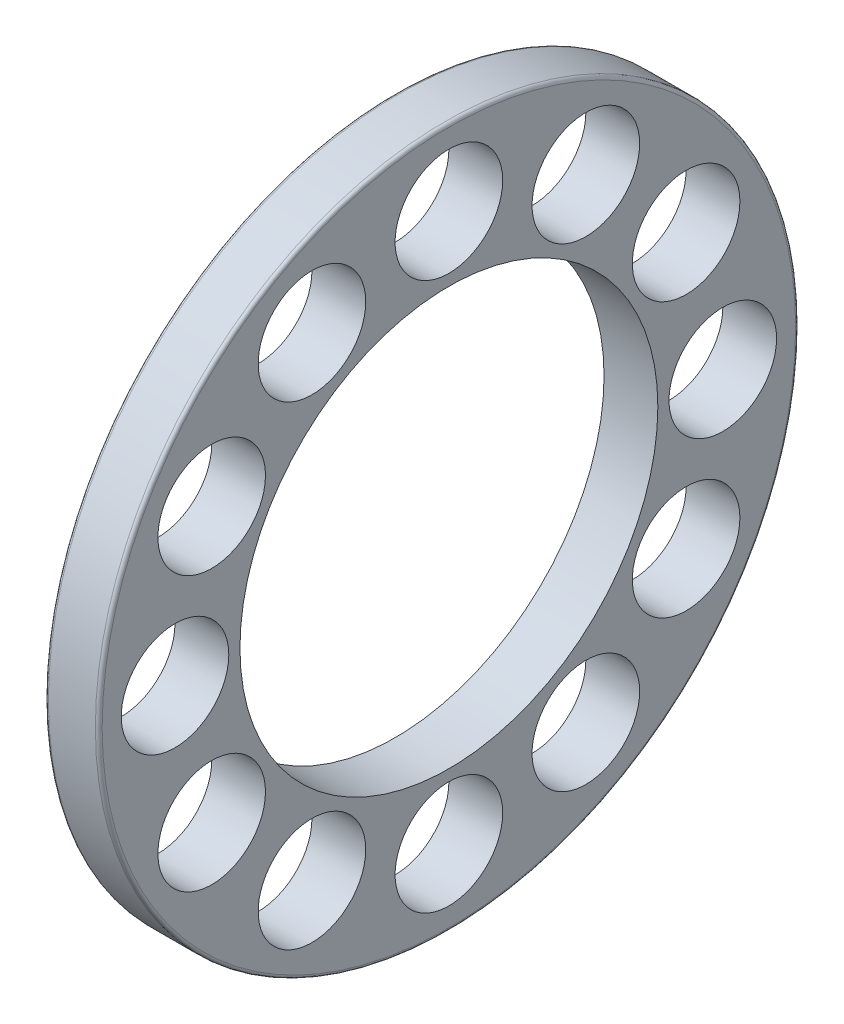
ISO-10303-21;
HEADER;
FILE_DESCRIPTION(('STEP AP214'),'2;1');
FILE_NAME('part.step','',(''),(''),'','','');
FILE_SCHEMA(('AUTOMOTIVE_DESIGN { 1 0 10303 214 1 1 1 1 }'));
ENDSEC;
DATA;
#1=APPLICATION_CONTEXT('core data for automotive mechanical design processes');
#2=APPLICATION_PROTOCOL_DEFINITION('international standard','automotive_design',2000,#1);
#3=PRODUCT_CONTEXT('',#1,'mechanical');
#4=PRODUCT('Part','Part','',(#3));
#5=PRODUCT_RELATED_PRODUCT_CATEGORY('part','',(#4));
#6=PRODUCT_DEFINITION_FORMATION('','',#4);
#7=PRODUCT_DEFINITION_CONTEXT('part definition',#1,'design');
#8=PRODUCT_DEFINITION('design','',#6,#7);
#9=PRODUCT_DEFINITION_SHAPE('','',#8);
#10=(LENGTH_UNIT() NAMED_UNIT(*) SI_UNIT(.MILLI.,.METRE.));
#11=(NAMED_UNIT(*) PLANE_ANGLE_UNIT() SI_UNIT($,.RADIAN.));
#12=(NAMED_UNIT(*) SI_UNIT($,.STERADIAN.) SOLID_ANGLE_UNIT());
#13=UNCERTAINTY_MEASURE_WITH_UNIT(LENGTH_MEASURE(1.E-05),#10,'distance_accuracy_value','');
#14=(GEOMETRIC_REPRESENTATION_CONTEXT(3) GLOBAL_UNCERTAINTY_ASSIGNED_CONTEXT((#13)) GLOBAL_UNIT_ASSIGNED_CONTEXT((#10,
#11,#12)) REPRESENTATION_CONTEXT('',''));
#15=CARTESIAN_POINT('',(0.,0.,0.));
#16=DIRECTION('',(0.,0.,1.));
#17=DIRECTION('',(1.,0.,0.));
#18=AXIS2_PLACEMENT_3D('',#15,#16,#17);
#19=CARTESIAN_POINT('',(11.08125,0.,0.));
#20=DIRECTION('',(1.,0.,0.));
#21=DIRECTION('',(0.,0.,-1.));
#22=AXIS2_PLACEMENT_3D('',#19,#20,#21);
#23=TOROIDAL_SURFACE('',#22,30.7,0.299999999999996);
#24=CARTESIAN_POINT('',(11.38125,0.,0.));
#25=DIRECTION('',(-1.,0.,0.));
#26=DIRECTION('',(0.,0.,-1.));
#27=AXIS2_PLACEMENT_3D('',#24,#25,#26);
#28=CIRCLE('',#27,30.7);
#29=CARTESIAN_POINT('',(11.38125,0.,-30.7));
#30=VERTEX_POINT('',#29);
#31=EDGE_CURVE('E114',#30,#30,#28,.F.);
#32=ORIENTED_EDGE('',*,*,#31,.F.);
#33=EDGE_LOOP('',(#32));
#34=FACE_BOUND('',#33,.T.);
#35=CARTESIAN_POINT('',(11.08125,0.,0.));
#36=DIRECTION('',(-1.,0.,0.));
#37=DIRECTION('',(0.,0.,1.));
#38=AXIS2_PLACEMENT_3D('',#35,#36,#37);
#39=CIRCLE('',#38,31.);
#40=CARTESIAN_POINT('',(11.08125,0.,31.));
#41=VERTEX_POINT('',#40);
#42=EDGE_CURVE('E110',#41,#41,#39,.T.);
#43=ORIENTED_EDGE('',*,*,#42,.F.);
#44=EDGE_LOOP('',(#43));
#45=FACE_BOUND('',#44,.T.);
#46=ADVANCED_FACE('F14',(#34,#45),#23,.T.);
#47=CARTESIAN_POINT('',(11.38125,18.5,0.));
#48=DIRECTION('',(1.,0.,0.));
#49=DIRECTION('',(0.,0.,-1.));
#50=AXIS2_PLACEMENT_3D('',#47,#48,#49);
#51=PLANE('',#50);
#52=CARTESIAN_POINT('',(11.38125,0.,0.));
#53=DIRECTION('',(-1.,0.,0.));
#54=DIRECTION('',(0.,0.,1.));
#55=AXIS2_PLACEMENT_3D('',#52,#53,#54);
#56=CIRCLE('',#55,18.5);
#57=CARTESIAN_POINT('',(11.38125,0.,18.5));
#58=VERTEX_POINT('',#57);
#59=EDGE_CURVE('E19',#58,#58,#56,.T.);
#60=ORIENTED_EDGE('',*,*,#59,.T.);
#61=EDGE_LOOP('',(#60));
#62=FACE_BOUND('',#61,.T.);
#63=CARTESIAN_POINT('',(11.38125,21.0011160417726,12.125));
#64=DIRECTION('',(1.,0.,0.));
#65=DIRECTION('',(0.,0.,-1.));
#66=AXIS2_PLACEMENT_3D('',#63,#64,#65);
#67=CIRCLE('',#66,4.7625);
#68=CARTESIAN_POINT('',(11.38125,21.0011160417726,7.3625));
#69=VERTEX_POINT('',#68);
#70=EDGE_CURVE('E73',#69,#69,#67,.F.);
#71=ORIENTED_EDGE('',*,*,#70,.T.);
#72=EDGE_LOOP('',(#71));
#73=FACE_BOUND('',#72,.T.);
#74=CARTESIAN_POINT('',(11.38125,12.125,21.0011160417726));
#75=DIRECTION('',(1.,0.,0.));
#76=DIRECTION('',(0.,0.,-1.));
#77=AXIS2_PLACEMENT_3D('',#74,#75,#76);
#78=CIRCLE('',#77,4.7625);
#79=CARTESIAN_POINT('',(11.38125,12.125,16.2386160417726));
#80=VERTEX_POINT('',#79);
#81=EDGE_CURVE('E76',#80,#80,#78,.F.);
#82=ORIENTED_EDGE('',*,*,#81,.T.);
#83=EDGE_LOOP('',(#82));
#84=FACE_BOUND('',#83,.T.);
#85=CARTESIAN_POINT('',(11.38125,0.,24.25));
#86=DIRECTION('',(1.,0.,0.));
#87=DIRECTION('',(0.,0.,-1.));
#88=AXIS2_PLACEMENT_3D('',#85,#86,#87);
#89=CIRCLE('',#88,4.7625);
#90=CARTESIAN_POINT('',(11.38125,0.,19.4875));
#91=VERTEX_POINT('',#90);
#92=EDGE_CURVE('E79',#91,#91,#89,.F.);
#93=ORIENTED_EDGE('',*,*,#92,.T.);
#94=EDGE_LOOP('',(#93));
#95=FACE_BOUND('',#94,.T.);
#96=CARTESIAN_POINT('',(11.38125,-12.125,21.0011160417726));
#97=DIRECTION('',(1.,0.,0.));
#98=DIRECTION('',(0.,0.,-1.));
#99=AXIS2_PLACEMENT_3D('',#96,#97,#98);
#100=CIRCLE('',#99,4.7625);
#101=CARTESIAN_POINT('',(11.38125,-12.125,16.2386160417726));
#102=VERTEX_POINT('',#101);
#103=EDGE_CURVE('E82',#102,#102,#100,.F.);
#104=ORIENTED_EDGE('',*,*,#103,.T.);
#105=EDGE_LOOP('',(#104));
#106=FACE_BOUND('',#105,.T.);
#107=CARTESIAN_POINT('',(11.38125,-21.0011160417726,12.125));
#108=DIRECTION('',(1.,0.,0.));
#109=DIRECTION('',(0.,0.,-1.));
#110=AXIS2_PLACEMENT_3D('',#107,#108,#109);
#111=CIRCLE('',#110,4.7625);
#112=CARTESIAN_POINT('',(11.38125,-21.0011160417726,7.3625));
#113=VERTEX_POINT('',#112);
#114=EDGE_CURVE('E85',#113,#113,#111,.F.);
#115=ORIENTED_EDGE('',*,*,#114,.T.);
#116=EDGE_LOOP('',(#115));
#117=FACE_BOUND('',#116,.T.);
#118=CARTESIAN_POINT('',(11.38125,-24.25,0.));
#119=DIRECTION('',(1.,0.,0.));
#120=DIRECTION('',(0.,0.,-1.));
#121=AXIS2_PLACEMENT_3D('',#118,#119,#120);
#122=CIRCLE('',#121,4.7625);
#123=CARTESIAN_POINT('',(11.38125,-24.25,-4.76249999999999));
#124=VERTEX_POINT('',#123);
#125=EDGE_CURVE('E88',#124,#124,#122,.F.);
#126=ORIENTED_EDGE('',*,*,#125,.T.);
#127=EDGE_LOOP('',(#126));
#128=FACE_BOUND('',#127,.T.);
#129=CARTESIAN_POINT('',(11.38125,-21.0011160417726,-12.125));
#130=DIRECTION('',(1.,0.,0.));
#131=DIRECTION('',(0.,0.,-1.));
#132=AXIS2_PLACEMENT_3D('',#129,#130,#131);
#133=CIRCLE('',#132,4.7625);
#134=CARTESIAN_POINT('',(11.38125,-21.0011160417726,-16.8875));
#135=VERTEX_POINT('',#134);
#136=EDGE_CURVE('E91',#135,#135,#133,.F.);
#137=ORIENTED_EDGE('',*,*,#136,.T.);
#138=EDGE_LOOP('',(#137));
#139=FACE_BOUND('',#138,.T.);
#140=CARTESIAN_POINT('',(11.38125,-12.125,-21.0011160417726));
#141=DIRECTION('',(1.,0.,0.));
#142=DIRECTION('',(0.,0.,-1.));
#143=AXIS2_PLACEMENT_3D('',#140,#141,#142);
#144=CIRCLE('',#143,4.7625);
#145=CARTESIAN_POINT('',(11.38125,-12.125,-25.7636160417726));
#146=VERTEX_POINT('',#145);
#147=EDGE_CURVE('E94',#146,#146,#144,.F.);
#148=ORIENTED_EDGE('',*,*,#147,.T.);
#149=EDGE_LOOP('',(#148));
#150=FACE_BOUND('',#149,.T.);
#151=CARTESIAN_POINT('',(11.38125,0.,-24.25));
#152=DIRECTION('',(1.,0.,0.));
#153=DIRECTION('',(0.,0.,-1.));
#154=AXIS2_PLACEMENT_3D('',#151,#152,#153);
#155=CIRCLE('',#154,4.7625);
#156=CARTESIAN_POINT('',(11.38125,0.,-29.0125));
#157=VERTEX_POINT('',#156);
#158=EDGE_CURVE('E97',#157,#157,#155,.F.);
#159=ORIENTED_EDGE('',*,*,#158,.T.);
#160=EDGE_LOOP('',(#159));
#161=FACE_BOUND('',#160,.T.);
#162=CARTESIAN_POINT('',(11.38125,12.125,-21.0011160417727));
#163=DIRECTION('',(1.,0.,0.));
#164=DIRECTION('',(0.,0.,-1.));
#165=AXIS2_PLACEMENT_3D('',#162,#163,#164);
#166=CIRCLE('',#165,4.7625);
#167=CARTESIAN_POINT('',(11.38125,12.125,-25.7636160417727));
#168=VERTEX_POINT('',#167);
#169=EDGE_CURVE('E100',#168,#168,#166,.F.);
#170=ORIENTED_EDGE('',*,*,#169,.T.);
#171=EDGE_LOOP('',(#170));
#172=FACE_BOUND('',#171,.T.);
#173=CARTESIAN_POINT('',(11.38125,21.0011160417726,-12.125));
#174=DIRECTION('',(1.,0.,0.));
#175=DIRECTION('',(0.,0.,-1.));
#176=AXIS2_PLACEMENT_3D('',#173,#174,#175);
#177=CIRCLE('',#176,4.7625);
#178=CARTESIAN_POINT('',(11.38125,21.0011160417726,-16.8875));
#179=VERTEX_POINT('',#178);
#180=EDGE_CURVE('E103',#179,#179,#177,.F.);
#181=ORIENTED_EDGE('',*,*,#180,.T.);
#182=EDGE_LOOP('',(#181));
#183=FACE_BOUND('',#182,.T.);
#184=CARTESIAN_POINT('',(11.38125,24.25,0.));
#185=DIRECTION('',(1.,0.,0.));
#186=DIRECTION('',(0.,0.,-1.));
#187=AXIS2_PLACEMENT_3D('',#184,#185,#186);
#188=CIRCLE('',#187,4.7625);
#189=CARTESIAN_POINT('',(11.38125,24.25,-4.7625));
#190=VERTEX_POINT('',#189);
#191=EDGE_CURVE('E105',#190,#190,#188,.F.);
#192=ORIENTED_EDGE('',*,*,#191,.T.);
#193=EDGE_LOOP('',(#192));
#194=FACE_BOUND('',#193,.T.);
#195=ORIENTED_EDGE('',*,*,#31,.T.);
#196=EDGE_LOOP('',(#195));
#197=FACE_BOUND('',#196,.T.);
#198=ADVANCED_FACE('F133',(#62,#73,#84,#95,#106,#117,#128,#139,#150,#161,#172,#183,#194,#197),
#51,.T.);
#199=CARTESIAN_POINT('',(11.38125,0.,0.));
#200=DIRECTION('',(-1.,0.,0.));
#201=DIRECTION('',(0.,0.,1.));
#202=AXIS2_PLACEMENT_3D('',#199,#200,#201);
#203=CYLINDRICAL_SURFACE('',#202,31.);
#204=ORIENTED_EDGE('',*,*,#42,.T.);
#205=EDGE_LOOP('',(#204));
#206=FACE_BOUND('',#205,.T.);
#207=CARTESIAN_POINT('',(6.91875,0.,0.));
#208=DIRECTION('',(1.,0.,0.));
#209=DIRECTION('',(0.,0.,-1.));
#210=AXIS2_PLACEMENT_3D('',#207,#208,#209);
#211=CIRCLE('',#210,31.);
#212=CARTESIAN_POINT('',(6.91875,0.,-31.));
#213=VERTEX_POINT('',#212);
#214=EDGE_CURVE('E72',#213,#213,#211,.F.);
#215=ORIENTED_EDGE('',*,*,#214,.F.);
#216=EDGE_LOOP('',(#215));
#217=FACE_BOUND('',#216,.T.);
#218=ADVANCED_FACE('F142',(#206,#217),#203,.T.);
#219=CARTESIAN_POINT('',(11.38125,0.,0.));
#220=DIRECTION('',(-1.,0.,0.));
#221=DIRECTION('',(0.,0.,1.));
#222=AXIS2_PLACEMENT_3D('',#219,#220,#221);
#223=CYLINDRICAL_SURFACE('',#222,18.5);
#224=CARTESIAN_POINT('',(6.61875,0.,0.));
#225=DIRECTION('',(-1.,0.,0.));
#226=DIRECTION('',(0.,0.,1.));
#227=AXIS2_PLACEMENT_3D('',#224,#225,#226);
#228=CIRCLE('',#227,18.5);
#229=CARTESIAN_POINT('',(6.61875,0.,18.5));
#230=VERTEX_POINT('',#229);
#231=EDGE_CURVE('E69',#230,#230,#228,.F.);
#232=ORIENTED_EDGE('',*,*,#231,.F.);
#233=EDGE_LOOP('',(#232));
#234=FACE_BOUND('',#233,.T.);
#235=ORIENTED_EDGE('',*,*,#59,.F.);
#236=EDGE_LOOP('',(#235));
#237=FACE_BOUND('',#236,.T.);
#238=ADVANCED_FACE('F145',(#234,#237),#223,.F.);
#239=CARTESIAN_POINT('',(18.,24.25,0.));
#240=DIRECTION('',(1.,0.,0.));
#241=DIRECTION('',(0.,0.,-1.));
#242=AXIS2_PLACEMENT_3D('',#239,#240,#241);
#243=CYLINDRICAL_SURFACE('',#242,4.7625);
#244=ORIENTED_EDGE('',*,*,#191,.F.);
#245=EDGE_LOOP('',(#244));
#246=FACE_BOUND('',#245,.T.);
#247=CARTESIAN_POINT('',(6.61875,24.25,0.));
#248=DIRECTION('',(1.,0.,0.));
#249=DIRECTION('',(0.,0.,-1.));
#250=AXIS2_PLACEMENT_3D('',#247,#248,#249);
#251=CIRCLE('',#250,4.7625);
#252=CARTESIAN_POINT('',(6.61875,24.25,-4.7625));
#253=VERTEX_POINT('',#252);
#254=EDGE_CURVE('E66',#253,#253,#251,.T.);
#255=ORIENTED_EDGE('',*,*,#254,.F.);
#256=EDGE_LOOP('',(#255));
#257=FACE_BOUND('',#256,.T.);
#258=ADVANCED_FACE('F148',(#246,#257),#243,.F.);
#259=CARTESIAN_POINT('',(18.,21.0011160417726,-12.125));
#260=DIRECTION('',(1.,0.,0.));
#261=DIRECTION('',(0.,0.,-1.));
#262=AXIS2_PLACEMENT_3D('',#259,#260,#261);
#263=CYLINDRICAL_SURFACE('',#262,4.7625);
#264=ORIENTED_EDGE('',*,*,#180,.F.);
#265=EDGE_LOOP('',(#264));
#266=FACE_BOUND('',#265,.T.);
#267=CARTESIAN_POINT('',(6.61875,21.0011160417726,-12.125));
#268=DIRECTION('',(1.,0.,0.));
#269=DIRECTION('',(0.,0.,-1.));
#270=AXIS2_PLACEMENT_3D('',#267,#268,#269);
#271=CIRCLE('',#270,4.7625);
#272=CARTESIAN_POINT('',(6.61875,21.0011160417726,-16.8875));
#273=VERTEX_POINT('',#272);
#274=EDGE_CURVE('E63',#273,#273,#271,.T.);
#275=ORIENTED_EDGE('',*,*,#274,.F.);
#276=EDGE_LOOP('',(#275));
#277=FACE_BOUND('',#276,.T.);
#278=ADVANCED_FACE('F152',(#266,#277),#263,.F.);
#279=CARTESIAN_POINT('',(18.,12.125,-21.0011160417727));
#280=DIRECTION('',(1.,0.,0.));
#281=DIRECTION('',(0.,0.,-1.));
#282=AXIS2_PLACEMENT_3D('',#279,#280,#281);
#283=CYLINDRICAL_SURFACE('',#282,4.7625);
#284=ORIENTED_EDGE('',*,*,#169,.F.);
#285=EDGE_LOOP('',(#284));
#286=FACE_BOUND('',#285,.T.);
#287=CARTESIAN_POINT('',(6.61875,12.125,-21.0011160417727));
#288=DIRECTION('',(1.,0.,0.));
#289=DIRECTION('',(0.,0.,-1.));
#290=AXIS2_PLACEMENT_3D('',#287,#288,#289);
#291=CIRCLE('',#290,4.7625);
#292=CARTESIAN_POINT('',(6.61875,12.125,-25.7636160417727));
#293=VERTEX_POINT('',#292);
#294=EDGE_CURVE('E60',#293,#293,#291,.T.);
#295=ORIENTED_EDGE('',*,*,#294,.F.);
#296=EDGE_LOOP('',(#295));
#297=FACE_BOUND('',#296,.T.);
#298=ADVANCED_FACE('F156',(#286,#297),#283,.F.);
#299=CARTESIAN_POINT('',(18.,0.,-24.25));
#300=DIRECTION('',(1.,0.,0.));
#301=DIRECTION('',(0.,0.,-1.));
#302=AXIS2_PLACEMENT_3D('',#299,#300,#301);
#303=CYLINDRICAL_SURFACE('',#302,4.7625);
#304=ORIENTED_EDGE('',*,*,#158,.F.);
#305=EDGE_LOOP('',(#304));
#306=FACE_BOUND('',#305,.T.);
#307=CARTESIAN_POINT('',(6.61875,0.,-24.25));
#308=DIRECTION('',(1.,0.,0.));
#309=DIRECTION('',(0.,0.,-1.));
#310=AXIS2_PLACEMENT_3D('',#307,#308,#309);
#311=CIRCLE('',#310,4.7625);
#312=CARTESIAN_POINT('',(6.61875,0.,-29.0125));
#313=VERTEX_POINT('',#312);
#314=EDGE_CURVE('E57',#313,#313,#311,.T.);
#315=ORIENTED_EDGE('',*,*,#314,.F.);
#316=EDGE_LOOP('',(#315));
#317=FACE_BOUND('',#316,.T.);
#318=ADVANCED_FACE('F160',(#306,#317),#303,.F.);
#319=CARTESIAN_POINT('',(18.,-12.125,-21.0011160417726));
#320=DIRECTION('',(1.,0.,0.));
#321=DIRECTION('',(0.,0.,-1.));
#322=AXIS2_PLACEMENT_3D('',#319,#320,#321);
#323=CYLINDRICAL_SURFACE('',#322,4.7625);
#324=ORIENTED_EDGE('',*,*,#147,.F.);
#325=EDGE_LOOP('',(#324));
#326=FACE_BOUND('',#325,.T.);
#327=CARTESIAN_POINT('',(6.61875,-12.125,-21.0011160417726));
#328=DIRECTION('',(1.,0.,0.));
#329=DIRECTION('',(0.,0.,-1.));
#330=AXIS2_PLACEMENT_3D('',#327,#328,#329);
#331=CIRCLE('',#330,4.7625);
#332=CARTESIAN_POINT('',(6.61875,-12.125,-25.7636160417726));
#333=VERTEX_POINT('',#332);
#334=EDGE_CURVE('E54',#333,#333,#331,.T.);
#335=ORIENTED_EDGE('',*,*,#334,.F.);
#336=EDGE_LOOP('',(#335));
#337=FACE_BOUND('',#336,.T.);
#338=ADVANCED_FACE('F164',(#326,#337),#323,.F.);
#339=CARTESIAN_POINT('',(18.,-21.0011160417726,-12.125));
#340=DIRECTION('',(1.,0.,0.));
#341=DIRECTION('',(0.,0.,-1.));
#342=AXIS2_PLACEMENT_3D('',#339,#340,#341);
#343=CYLINDRICAL_SURFACE('',#342,4.7625);
#344=ORIENTED_EDGE('',*,*,#136,.F.);
#345=EDGE_LOOP('',(#344));
#346=FACE_BOUND('',#345,.T.);
#347=CARTESIAN_POINT('',(6.61875,-21.0011160417726,-12.125));
#348=DIRECTION('',(1.,0.,0.));
#349=DIRECTION('',(0.,0.,-1.));
#350=AXIS2_PLACEMENT_3D('',#347,#348,#349);
#351=CIRCLE('',#350,4.7625);
#352=CARTESIAN_POINT('',(6.61875,-21.0011160417726,-16.8875));
#353=VERTEX_POINT('',#352);
#354=EDGE_CURVE('E51',#353,#353,#351,.T.);
#355=ORIENTED_EDGE('',*,*,#354,.F.);
#356=EDGE_LOOP('',(#355));
#357=FACE_BOUND('',#356,.T.);
#358=ADVANCED_FACE('F168',(#346,#357),#343,.F.);
#359=CARTESIAN_POINT('',(18.,-24.25,0.));
#360=DIRECTION('',(1.,0.,0.));
#361=DIRECTION('',(0.,0.,-1.));
#362=AXIS2_PLACEMENT_3D('',#359,#360,#361);
#363=CYLINDRICAL_SURFACE('',#362,4.7625);
#364=ORIENTED_EDGE('',*,*,#125,.F.);
#365=EDGE_LOOP('',(#364));
#366=FACE_BOUND('',#365,.T.);
#367=CARTESIAN_POINT('',(6.61875,-24.25,0.));
#368=DIRECTION('',(1.,0.,0.));
#369=DIRECTION('',(0.,0.,-1.));
#370=AXIS2_PLACEMENT_3D('',#367,#368,#369);
#371=CIRCLE('',#370,4.7625);
#372=CARTESIAN_POINT('',(6.61875,-24.25,-4.76249999999999));
#373=VERTEX_POINT('',#372);
#374=EDGE_CURVE('E48',#373,#373,#371,.T.);
#375=ORIENTED_EDGE('',*,*,#374,.F.);
#376=EDGE_LOOP('',(#375));
#377=FACE_BOUND('',#376,.T.);
#378=ADVANCED_FACE('F172',(#366,#377),#363,.F.);
#379=CARTESIAN_POINT('',(18.,-21.0011160417726,12.125));
#380=DIRECTION('',(1.,0.,0.));
#381=DIRECTION('',(0.,0.,-1.));
#382=AXIS2_PLACEMENT_3D('',#379,#380,#381);
#383=CYLINDRICAL_SURFACE('',#382,4.7625);
#384=ORIENTED_EDGE('',*,*,#114,.F.);
#385=EDGE_LOOP('',(#384));
#386=FACE_BOUND('',#385,.T.);
#387=CARTESIAN_POINT('',(6.61875,-21.0011160417726,12.125));
#388=DIRECTION('',(1.,0.,0.));
#389=DIRECTION('',(0.,0.,-1.));
#390=AXIS2_PLACEMENT_3D('',#387,#388,#389);
#391=CIRCLE('',#390,4.7625);
#392=CARTESIAN_POINT('',(6.61875,-21.0011160417726,7.3625));
#393=VERTEX_POINT('',#392);
#394=EDGE_CURVE('E45',#393,#393,#391,.T.);
#395=ORIENTED_EDGE('',*,*,#394,.F.);
#396=EDGE_LOOP('',(#395));
#397=FACE_BOUND('',#396,.T.);
#398=ADVANCED_FACE('F176',(#386,#397),#383,.F.);
#399=CARTESIAN_POINT('',(18.,-12.125,21.0011160417726));
#400=DIRECTION('',(1.,0.,0.));
#401=DIRECTION('',(0.,0.,-1.));
#402=AXIS2_PLACEMENT_3D('',#399,#400,#401);
#403=CYLINDRICAL_SURFACE('',#402,4.7625);
#404=ORIENTED_EDGE('',*,*,#103,.F.);
#405=EDGE_LOOP('',(#404));
#406=FACE_BOUND('',#405,.T.);
#407=CARTESIAN_POINT('',(6.61875,-12.125,21.0011160417726));
#408=DIRECTION('',(1.,0.,0.));
#409=DIRECTION('',(0.,0.,-1.));
#410=AXIS2_PLACEMENT_3D('',#407,#408,#409);
#411=CIRCLE('',#410,4.7625);
#412=CARTESIAN_POINT('',(6.61875,-12.125,16.2386160417726));
#413=VERTEX_POINT('',#412);
#414=EDGE_CURVE('E42',#413,#413,#411,.T.);
#415=ORIENTED_EDGE('',*,*,#414,.F.);
#416=EDGE_LOOP('',(#415));
#417=FACE_BOUND('',#416,.T.);
#418=ADVANCED_FACE('F180',(#406,#417),#403,.F.);
#419=CARTESIAN_POINT('',(18.,0.,24.25));
#420=DIRECTION('',(1.,0.,0.));
#421=DIRECTION('',(0.,0.,-1.));
#422=AXIS2_PLACEMENT_3D('',#419,#420,#421);
#423=CYLINDRICAL_SURFACE('',#422,4.7625);
#424=ORIENTED_EDGE('',*,*,#92,.F.);
#425=EDGE_LOOP('',(#424));
#426=FACE_BOUND('',#425,.T.);
#427=CARTESIAN_POINT('',(6.61875,0.,24.25));
#428=DIRECTION('',(1.,0.,0.));
#429=DIRECTION('',(0.,0.,-1.));
#430=AXIS2_PLACEMENT_3D('',#427,#428,#429);
#431=CIRCLE('',#430,4.7625);
#432=CARTESIAN_POINT('',(6.61875,0.,19.4875));
#433=VERTEX_POINT('',#432);
#434=EDGE_CURVE('E33',#433,#433,#431,.T.);
#435=ORIENTED_EDGE('',*,*,#434,.F.);
#436=EDGE_LOOP('',(#435));
#437=FACE_BOUND('',#436,.T.);
#438=ADVANCED_FACE('F184',(#426,#437),#423,.F.);
#439=CARTESIAN_POINT('',(18.,12.125,21.0011160417726));
#440=DIRECTION('',(1.,0.,0.));
#441=DIRECTION('',(0.,0.,-1.));
#442=AXIS2_PLACEMENT_3D('',#439,#440,#441);
#443=CYLINDRICAL_SURFACE('',#442,4.7625);
#444=ORIENTED_EDGE('',*,*,#81,.F.);
#445=EDGE_LOOP('',(#444));
#446=FACE_BOUND('',#445,.T.);
#447=CARTESIAN_POINT('',(6.61875,12.125,21.0011160417726));
#448=DIRECTION('',(1.,0.,0.));
#449=DIRECTION('',(0.,0.,-1.));
#450=AXIS2_PLACEMENT_3D('',#447,#448,#449);
#451=CIRCLE('',#450,4.7625);
#452=CARTESIAN_POINT('',(6.61875,12.125,16.2386160417726));
#453=VERTEX_POINT('',#452);
#454=EDGE_CURVE('E28',#453,#453,#451,.T.);
#455=ORIENTED_EDGE('',*,*,#454,.F.);
#456=EDGE_LOOP('',(#455));
#457=FACE_BOUND('',#456,.T.);
#458=ADVANCED_FACE('F188',(#446,#457),#443,.F.);
#459=CARTESIAN_POINT('',(18.,21.0011160417726,12.125));
#460=DIRECTION('',(1.,0.,0.));
#461=DIRECTION('',(0.,0.,-1.));
#462=AXIS2_PLACEMENT_3D('',#459,#460,#461);
#463=CYLINDRICAL_SURFACE('',#462,4.7625);
#464=ORIENTED_EDGE('',*,*,#70,.F.);
#465=EDGE_LOOP('',(#464));
#466=FACE_BOUND('',#465,.T.);
#467=CARTESIAN_POINT('',(6.61875,21.0011160417726,12.125));
#468=DIRECTION('',(1.,0.,0.));
#469=DIRECTION('',(0.,0.,-1.));
#470=AXIS2_PLACEMENT_3D('',#467,#468,#469);
#471=CIRCLE('',#470,4.7625);
#472=CARTESIAN_POINT('',(6.61875,21.0011160417726,7.3625));
#473=VERTEX_POINT('',#472);
#474=EDGE_CURVE('E23',#473,#473,#471,.T.);
#475=ORIENTED_EDGE('',*,*,#474,.F.);
#476=EDGE_LOOP('',(#475));
#477=FACE_BOUND('',#476,.T.);
#478=ADVANCED_FACE('F192',(#466,#477),#463,.F.);
#479=CARTESIAN_POINT('',(6.91875,0.,0.));
#480=DIRECTION('',(1.,0.,0.));
#481=DIRECTION('',(0.,0.,-1.));
#482=AXIS2_PLACEMENT_3D('',#479,#480,#481);
#483=TOROIDAL_SURFACE('',#482,30.7,0.300000000000002);
#484=ORIENTED_EDGE('',*,*,#214,.T.);
#485=EDGE_LOOP('',(#484));
#486=FACE_BOUND('',#485,.T.);
#487=CARTESIAN_POINT('',(6.61875,0.,0.));
#488=DIRECTION('',(1.,0.,0.));
#489=DIRECTION('',(0.,0.,-1.));
#490=AXIS2_PLACEMENT_3D('',#487,#488,#489);
#491=CIRCLE('',#490,30.7);
#492=CARTESIAN_POINT('',(6.61875,0.,-30.7));
#493=VERTEX_POINT('',#492);
#494=EDGE_CURVE('E10',#493,#493,#491,.F.);
#495=ORIENTED_EDGE('',*,*,#494,.F.);
#496=EDGE_LOOP('',(#495));
#497=FACE_BOUND('',#496,.T.);
#498=ADVANCED_FACE('F195',(#486,#497),#483,.T.);
#499=CARTESIAN_POINT('',(6.61875,30.7,0.));
#500=DIRECTION('',(-1.,0.,0.));
#501=DIRECTION('',(0.,0.,1.));
#502=AXIS2_PLACEMENT_3D('',#499,#500,#501);
#503=PLANE('',#502);
#504=ORIENTED_EDGE('',*,*,#494,.T.);
#505=EDGE_LOOP('',(#504));
#506=FACE_BOUND('',#505,.T.);
#507=ORIENTED_EDGE('',*,*,#474,.T.);
#508=EDGE_LOOP('',(#507));
#509=FACE_BOUND('',#508,.T.);
#510=ORIENTED_EDGE('',*,*,#454,.T.);
#511=EDGE_LOOP('',(#510));
#512=FACE_BOUND('',#511,.T.);
#513=ORIENTED_EDGE('',*,*,#434,.T.);
#514=EDGE_LOOP('',(#513));
#515=FACE_BOUND('',#514,.T.);
#516=ORIENTED_EDGE('',*,*,#414,.T.);
#517=EDGE_LOOP('',(#516));
#518=FACE_BOUND('',#517,.T.);
#519=ORIENTED_EDGE('',*,*,#394,.T.);
#520=EDGE_LOOP('',(#519));
#521=FACE_BOUND('',#520,.T.);
#522=ORIENTED_EDGE('',*,*,#374,.T.);
#523=EDGE_LOOP('',(#522));
#524=FACE_BOUND('',#523,.T.);
#525=ORIENTED_EDGE('',*,*,#354,.T.);
#526=EDGE_LOOP('',(#525));
#527=FACE_BOUND('',#526,.T.);
#528=ORIENTED_EDGE('',*,*,#334,.T.);
#529=EDGE_LOOP('',(#528));
#530=FACE_BOUND('',#529,.T.);
#531=ORIENTED_EDGE('',*,*,#314,.T.);
#532=EDGE_LOOP('',(#531));
#533=FACE_BOUND('',#532,.T.);
#534=ORIENTED_EDGE('',*,*,#294,.T.);
#535=EDGE_LOOP('',(#534));
#536=FACE_BOUND('',#535,.T.);
#537=ORIENTED_EDGE('',*,*,#274,.T.);
#538=EDGE_LOOP('',(#537));
#539=FACE_BOUND('',#538,.T.);
#540=ORIENTED_EDGE('',*,*,#254,.T.);
#541=EDGE_LOOP('',(#540));
#542=FACE_BOUND('',#541,.T.);
#543=ORIENTED_EDGE('',*,*,#231,.T.);
#544=EDGE_LOOP('',(#543));
#545=FACE_BOUND('',#544,.T.);
#546=ADVANCED_FACE('F201',(#506,#509,#512,#515,#518,#521,#524,#527,#530,#533,#536,#539,#542,
#545),#503,.T.);
#547=CLOSED_SHELL('',(#46,#198,#218,#238,#258,#278,#298,#318,#338,#358,#378,#398,#418,#438,#458,
#478,#498,#546));
#548=MANIFOLD_SOLID_BREP('B1',#547);
#549=ADVANCED_BREP_SHAPE_REPRESENTATION('',(#18,#548),#14);
#550=SHAPE_DEFINITION_REPRESENTATION(#9,#549);
ENDSEC;
END-ISO-10303-21;
